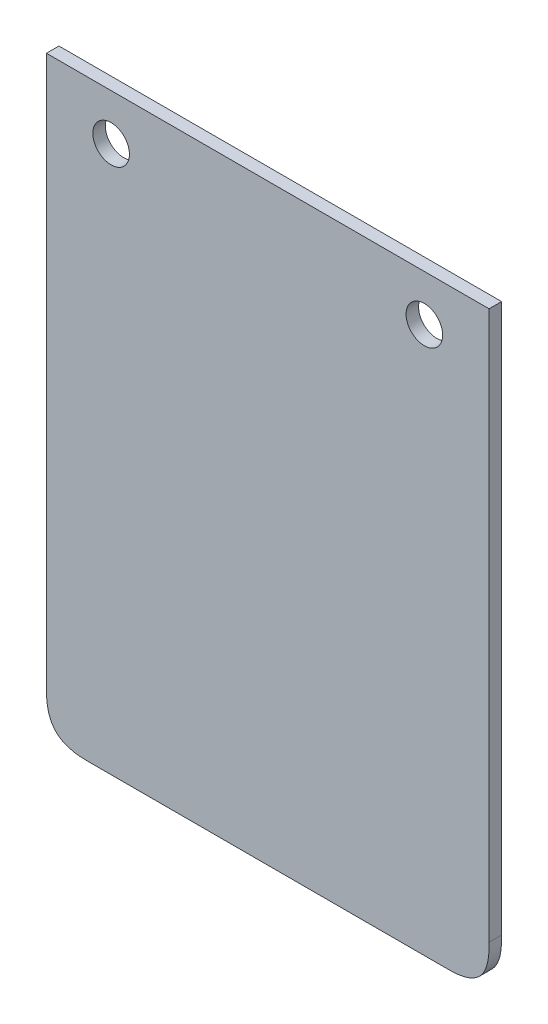
ISO-10303-21;
HEADER;
FILE_DESCRIPTION(('STEP AP214'),'2;1');
FILE_NAME('part.step','',(''),(''),'','','');
FILE_SCHEMA(('AUTOMOTIVE_DESIGN { 1 0 10303 214 1 1 1 1 }'));
ENDSEC;
DATA;
#1=APPLICATION_CONTEXT('core data for automotive mechanical design processes');
#2=APPLICATION_PROTOCOL_DEFINITION('international standard','automotive_design',2000,#1);
#3=PRODUCT_CONTEXT('',#1,'mechanical');
#4=PRODUCT('Part','Part','',(#3));
#5=PRODUCT_RELATED_PRODUCT_CATEGORY('part','',(#4));
#6=PRODUCT_DEFINITION_FORMATION('','',#4);
#7=PRODUCT_DEFINITION_CONTEXT('part definition',#1,'design');
#8=PRODUCT_DEFINITION('design','',#6,#7);
#9=PRODUCT_DEFINITION_SHAPE('','',#8);
#10=(LENGTH_UNIT() NAMED_UNIT(*) SI_UNIT(.MILLI.,.METRE.));
#11=(NAMED_UNIT(*) PLANE_ANGLE_UNIT() SI_UNIT($,.RADIAN.));
#12=(NAMED_UNIT(*) SI_UNIT($,.STERADIAN.) SOLID_ANGLE_UNIT());
#13=UNCERTAINTY_MEASURE_WITH_UNIT(LENGTH_MEASURE(1.E-05),#10,'distance_accuracy_value','');
#14=(GEOMETRIC_REPRESENTATION_CONTEXT(3) GLOBAL_UNCERTAINTY_ASSIGNED_CONTEXT((#13)) GLOBAL_UNIT_ASSIGNED_CONTEXT((#10,
#11,#12)) REPRESENTATION_CONTEXT('',''));
#15=CARTESIAN_POINT('',(0.,0.,0.));
#16=DIRECTION('',(0.,0.,1.));
#17=DIRECTION('',(1.,0.,0.));
#18=AXIS2_PLACEMENT_3D('',#15,#16,#17);
#19=CARTESIAN_POINT('',(-17.6691646267636,-20.1512394100629,1.));
#20=CARTESIAN_POINT('',(-17.6691646267636,-20.6231904776552,1.));
#21=CARTESIAN_POINT('',(-17.6527373194908,-20.8776964747589,1.));
#22=CARTESIAN_POINT('',(-17.627480029952,-21.2690041645368,1.));
#23=CARTESIAN_POINT('',(-17.554652674592,-21.5966677912601,1.));
#24=CARTESIAN_POINT('',(-17.3748195500365,-22.4057699961333,1.));
#25=CARTESIAN_POINT('',(-16.90299751508,-22.879712106307,1.));
#26=CARTESIAN_POINT('',(-16.4309295170986,-23.3539012847107,1.));
#27=CARTESIAN_POINT('',(-15.619627321153,-23.5356042355007,1.));
#28=CARTESIAN_POINT('',(-15.2926653300199,-23.6088321385952,1.));
#29=CARTESIAN_POINT('',(-14.9001363423189,-23.6345186891479,1.));
#30=CARTESIAN_POINT('',(-14.6446186681602,-23.6512394100629,1.));
#31=CARTESIAN_POINT('',(-14.1691646267636,-23.6512394100629,1.));
#32=B_SPLINE_CURVE_WITH_KNOTS('',2,(#19,#20,#21,#22,#23,#24,#25,#26,#27,#28,#29,#30,#31),
.UNSPECIFIED.,.F.,.F.,(3,2,2,2,2,2,3),(0.,0.125,0.25,0.5,0.75,0.875,1.),.UNSPECIFIED.);
#33=DIRECTION('',(0.,0.,-1.));
#34=VECTOR('',#33,1.);
#35=SURFACE_OF_LINEAR_EXTRUSION('',#32,#34);
#36=CARTESIAN_POINT('',(-17.6691646267636,-20.1512394100629,0.));
#37=CARTESIAN_POINT('',(-17.6691646267636,-20.6231904776552,0.));
#38=CARTESIAN_POINT('',(-17.6527373194908,-20.8776964747589,0.));
#39=CARTESIAN_POINT('',(-17.627480029952,-21.2690041645368,0.));
#40=CARTESIAN_POINT('',(-17.554652674592,-21.5966677912601,0.));
#41=CARTESIAN_POINT('',(-17.3748195500365,-22.4057699961333,0.));
#42=CARTESIAN_POINT('',(-16.90299751508,-22.879712106307,0.));
#43=CARTESIAN_POINT('',(-16.4309295170986,-23.3539012847107,0.));
#44=CARTESIAN_POINT('',(-15.619627321153,-23.5356042355007,0.));
#45=CARTESIAN_POINT('',(-15.2926653300199,-23.6088321385952,0.));
#46=CARTESIAN_POINT('',(-14.9001363423189,-23.6345186891479,0.));
#47=CARTESIAN_POINT('',(-14.6446186681602,-23.6512394100629,0.));
#48=CARTESIAN_POINT('',(-14.1691646267636,-23.6512394100629,0.));
#49=B_SPLINE_CURVE_WITH_KNOTS('',2,(#36,#37,#38,#39,#40,#41,#42,#43,#44,#45,#46,#47,#48),
.UNSPECIFIED.,.F.,.F.,(3,2,2,2,2,2,3),(0.,0.125,0.25,0.5,0.75,0.875,1.),.UNSPECIFIED.);
#50=CARTESIAN_POINT('',(-17.6691646267636,-20.1512394100629,0.));
#51=VERTEX_POINT('',#50);
#52=CARTESIAN_POINT('',(-14.1691646267636,-23.6512394100629,0.));
#53=VERTEX_POINT('',#52);
#54=EDGE_CURVE('E183',#51,#53,#49,.T.);
#55=ORIENTED_EDGE('',*,*,#54,.T.);
#56=DIRECTION('',(0.,0.,-1.));
#57=VECTOR('',#56,1.);
#58=CARTESIAN_POINT('',(-14.1691646267636,-23.6512394100629,1.));
#59=LINE('',#58,#57);
#60=CARTESIAN_POINT('',(-14.1691646267636,-23.6512394100629,1.));
#61=VERTEX_POINT('',#60);
#62=EDGE_CURVE('E11',#61,#53,#59,.T.);
#63=ORIENTED_EDGE('',*,*,#62,.F.);
#64=CARTESIAN_POINT('',(-14.1691646267636,-23.6512394100629,1.));
#65=CARTESIAN_POINT('',(-14.6446186681602,-23.6512394100629,1.));
#66=CARTESIAN_POINT('',(-14.9001363423189,-23.6345186891479,1.));
#67=CARTESIAN_POINT('',(-15.2926653300199,-23.6088321385952,1.));
#68=CARTESIAN_POINT('',(-15.619627321153,-23.5356042355007,1.));
#69=CARTESIAN_POINT('',(-16.4309295170986,-23.3539012847107,1.));
#70=CARTESIAN_POINT('',(-16.90299751508,-22.879712106307,1.));
#71=CARTESIAN_POINT('',(-17.3748195500365,-22.4057699961333,1.));
#72=CARTESIAN_POINT('',(-17.554652674592,-21.5966677912601,1.));
#73=CARTESIAN_POINT('',(-17.627480029952,-21.2690041645368,1.));
#74=CARTESIAN_POINT('',(-17.6527373194908,-20.8776964747589,1.));
#75=CARTESIAN_POINT('',(-17.6691646267636,-20.6231904776552,1.));
#76=CARTESIAN_POINT('',(-17.6691646267636,-20.1512394100629,1.));
#77=B_SPLINE_CURVE_WITH_KNOTS('',2,(#64,#65,#66,#67,#68,#69,#70,#71,#72,#73,#74,#75,#76),
.UNSPECIFIED.,.F.,.F.,(3,2,2,2,2,2,3),(0.,0.125,0.25,0.5,0.75,0.875,1.),.UNSPECIFIED.);
#78=CARTESIAN_POINT('',(-17.6691646267636,-20.1512394100629,1.));
#79=VERTEX_POINT('',#78);
#80=EDGE_CURVE('E164',#79,#61,#77,.F.);
#81=ORIENTED_EDGE('',*,*,#80,.F.);
#82=DIRECTION('',(0.,0.,-1.));
#83=VECTOR('',#82,1.);
#84=CARTESIAN_POINT('',(-17.6691646267636,-20.1512394100629,1.));
#85=LINE('',#84,#83);
#86=EDGE_CURVE('E118',#79,#51,#85,.T.);
#87=ORIENTED_EDGE('',*,*,#86,.T.);
#88=EDGE_LOOP('',(#55,#63,#81,#87));
#89=FACE_BOUND('',#88,.T.);
#90=ADVANCED_FACE('F33',(#89),#35,.F.);
#91=CARTESIAN_POINT('',(-14.1691646267636,-23.6512394100629,1.));
#92=DIRECTION('',(0.,1.,0.));
#93=DIRECTION('',(-1.,0.,0.));
#94=AXIS2_PLACEMENT_3D('',#91,#92,#93);
#95=PLANE('',#94);
#96=DIRECTION('',(1.,0.,0.));
#97=VECTOR('',#96,1.);
#98=CARTESIAN_POINT('',(-14.1691646267636,-23.6512394100629,0.));
#99=LINE('',#98,#97);
#100=CARTESIAN_POINT('',(14.1691646267636,-23.6512394100629,0.));
#101=VERTEX_POINT('',#100);
#102=EDGE_CURVE('E209',#53,#101,#99,.T.);
#103=ORIENTED_EDGE('',*,*,#102,.T.);
#104=DIRECTION('',(0.,0.,-1.));
#105=VECTOR('',#104,1.);
#106=CARTESIAN_POINT('',(14.1691646267636,-23.6512394100629,1.));
#107=LINE('',#106,#105);
#108=CARTESIAN_POINT('',(14.1691646267636,-23.6512394100629,1.));
#109=VERTEX_POINT('',#108);
#110=EDGE_CURVE('E44',#109,#101,#107,.T.);
#111=ORIENTED_EDGE('',*,*,#110,.F.);
#112=DIRECTION('',(1.,0.,0.));
#113=VECTOR('',#112,1.);
#114=CARTESIAN_POINT('',(-14.1691646267636,-23.6512394100629,1.));
#115=LINE('',#114,#113);
#116=EDGE_CURVE('E90',#61,#109,#115,.T.);
#117=ORIENTED_EDGE('',*,*,#116,.F.);
#118=ORIENTED_EDGE('',*,*,#62,.T.);
#119=EDGE_LOOP('',(#103,#111,#117,#118));
#120=FACE_BOUND('',#119,.T.);
#121=ADVANCED_FACE('F234',(#120),#95,.F.);
#122=CARTESIAN_POINT('',(14.1691646267636,-23.6512394100629,1.));
#123=CARTESIAN_POINT('',(14.6411156943294,-23.6512394100629,1.));
#124=CARTESIAN_POINT('',(14.8956216914596,-23.63481210279,1.));
#125=CARTESIAN_POINT('',(15.2869293811867,-23.6095548132572,1.));
#126=CARTESIAN_POINT('',(15.6145930079608,-23.5367274578913,1.));
#127=CARTESIAN_POINT('',(16.4236952128188,-23.3568943333525,1.));
#128=CARTESIAN_POINT('',(16.8976373230077,-22.8850722983793,1.));
#129=CARTESIAN_POINT('',(17.371826501409,-22.4130043003988,1.));
#130=CARTESIAN_POINT('',(17.5535294522014,-21.6017021044523,1.));
#131=CARTESIAN_POINT('',(17.6267573552938,-21.2747401133328,1.));
#132=CARTESIAN_POINT('',(17.6524439058486,-20.8822111256182,1.));
#133=CARTESIAN_POINT('',(17.6691646267636,-20.6266934514722,1.));
#134=CARTESIAN_POINT('',(17.6691646267636,-20.1512394100629,1.));
#135=B_SPLINE_CURVE_WITH_KNOTS('',2,(#122,#123,#124,#125,#126,#127,#128,#129,#130,#131,#132,
#133,#134),.UNSPECIFIED.,.F.,.F.,(3,2,2,2,2,2,3),(0.,0.125,0.25,0.5,0.75,0.875,1.),.UNSPECIFIED.);
#136=DIRECTION('',(0.,0.,-1.));
#137=VECTOR('',#136,1.);
#138=SURFACE_OF_LINEAR_EXTRUSION('',#135,#137);
#139=CARTESIAN_POINT('',(14.1691646267636,-23.6512394100629,0.));
#140=CARTESIAN_POINT('',(14.6411156943294,-23.6512394100629,0.));
#141=CARTESIAN_POINT('',(14.8956216914596,-23.63481210279,0.));
#142=CARTESIAN_POINT('',(15.2869293811867,-23.6095548132572,0.));
#143=CARTESIAN_POINT('',(15.6145930079608,-23.5367274578913,0.));
#144=CARTESIAN_POINT('',(16.4236952128188,-23.3568943333525,0.));
#145=CARTESIAN_POINT('',(16.8976373230077,-22.8850722983793,0.));
#146=CARTESIAN_POINT('',(17.371826501409,-22.4130043003988,0.));
#147=CARTESIAN_POINT('',(17.5535294522014,-21.6017021044523,0.));
#148=CARTESIAN_POINT('',(17.6267573552938,-21.2747401133328,0.));
#149=CARTESIAN_POINT('',(17.6524439058486,-20.8822111256182,0.));
#150=CARTESIAN_POINT('',(17.6691646267636,-20.6266934514722,0.));
#151=CARTESIAN_POINT('',(17.6691646267636,-20.1512394100629,0.));
#152=B_SPLINE_CURVE_WITH_KNOTS('',2,(#139,#140,#141,#142,#143,#144,#145,#146,#147,#148,#149,
#150,#151),.UNSPECIFIED.,.F.,.F.,(3,2,2,2,2,2,3),(0.,0.125,0.25,0.5,0.75,0.875,1.),.UNSPECIFIED.);
#153=CARTESIAN_POINT('',(17.6691646267636,-20.1512394100629,0.));
#154=VERTEX_POINT('',#153);
#155=EDGE_CURVE('E264',#101,#154,#152,.T.);
#156=ORIENTED_EDGE('',*,*,#155,.T.);
#157=DIRECTION('',(0.,0.,-1.));
#158=VECTOR('',#157,1.);
#159=CARTESIAN_POINT('',(17.6691646267636,-20.1512394100629,1.));
#160=LINE('',#159,#158);
#161=CARTESIAN_POINT('',(17.6691646267636,-20.1512394100629,1.));
#162=VERTEX_POINT('',#161);
#163=EDGE_CURVE('E113',#162,#154,#160,.T.);
#164=ORIENTED_EDGE('',*,*,#163,.F.);
#165=CARTESIAN_POINT('',(17.6691646267636,-20.1512394100629,1.));
#166=CARTESIAN_POINT('',(17.6691646267636,-20.6266934514722,1.));
#167=CARTESIAN_POINT('',(17.6524439058486,-20.8822111256182,1.));
#168=CARTESIAN_POINT('',(17.6267573552938,-21.2747401133328,1.));
#169=CARTESIAN_POINT('',(17.5535294522014,-21.6017021044523,1.));
#170=CARTESIAN_POINT('',(17.371826501409,-22.4130043003988,1.));
#171=CARTESIAN_POINT('',(16.8976373230077,-22.8850722983793,1.));
#172=CARTESIAN_POINT('',(16.4236952128188,-23.3568943333525,1.));
#173=CARTESIAN_POINT('',(15.6145930079608,-23.5367274578913,1.));
#174=CARTESIAN_POINT('',(15.2869293811867,-23.6095548132572,1.));
#175=CARTESIAN_POINT('',(14.8956216914596,-23.63481210279,1.));
#176=CARTESIAN_POINT('',(14.6411156943294,-23.6512394100629,1.));
#177=CARTESIAN_POINT('',(14.1691646267636,-23.6512394100629,1.));
#178=B_SPLINE_CURVE_WITH_KNOTS('',2,(#165,#166,#167,#168,#169,#170,#171,#172,#173,#174,#175,
#176,#177),.UNSPECIFIED.,.F.,.F.,(3,2,2,2,2,2,3),(0.,0.125,0.25,0.5,0.75,0.875,1.),.UNSPECIFIED.);
#179=EDGE_CURVE('E103',#109,#162,#178,.F.);
#180=ORIENTED_EDGE('',*,*,#179,.F.);
#181=ORIENTED_EDGE('',*,*,#110,.T.);
#182=EDGE_LOOP('',(#156,#164,#180,#181));
#183=FACE_BOUND('',#182,.T.);
#184=ADVANCED_FACE('F238',(#183),#138,.F.);
#185=CARTESIAN_POINT('',(17.6691646267636,-20.1512394100629,1.));
#186=DIRECTION('',(-1.,0.,0.));
#187=DIRECTION('',(0.,-1.,0.));
#188=AXIS2_PLACEMENT_3D('',#185,#186,#187);
#189=PLANE('',#188);
#190=DIRECTION('',(0.,1.,0.));
#191=VECTOR('',#190,1.);
#192=CARTESIAN_POINT('',(17.6691646267636,-20.1512394100629,0.));
#193=LINE('',#192,#191);
#194=CARTESIAN_POINT('',(17.6691646267636,23.6512394100629,0.));
#195=VERTEX_POINT('',#194);
#196=EDGE_CURVE('E112',#154,#195,#193,.T.);
#197=ORIENTED_EDGE('',*,*,#196,.T.);
#198=DIRECTION('',(0.,0.,-1.));
#199=VECTOR('',#198,1.);
#200=CARTESIAN_POINT('',(17.6691646267636,23.6512394100629,1.));
#201=LINE('',#200,#199);
#202=CARTESIAN_POINT('',(17.6691646267636,23.6512394100629,1.));
#203=VERTEX_POINT('',#202);
#204=EDGE_CURVE('E109',#203,#195,#201,.T.);
#205=ORIENTED_EDGE('',*,*,#204,.F.);
#206=DIRECTION('',(0.,1.,0.));
#207=VECTOR('',#206,1.);
#208=CARTESIAN_POINT('',(17.6691646267636,-20.1512394100629,1.));
#209=LINE('',#208,#207);
#210=EDGE_CURVE('E97',#162,#203,#209,.T.);
#211=ORIENTED_EDGE('',*,*,#210,.F.);
#212=ORIENTED_EDGE('',*,*,#163,.T.);
#213=EDGE_LOOP('',(#197,#205,#211,#212));
#214=FACE_BOUND('',#213,.T.);
#215=ADVANCED_FACE('F110',(#214),#189,.F.);
#216=CARTESIAN_POINT('',(17.6691646267636,23.6512394100629,1.));
#217=DIRECTION('',(0.,-1.,0.));
#218=DIRECTION('',(0.,0.,-1.));
#219=AXIS2_PLACEMENT_3D('',#216,#217,#218);
#220=PLANE('',#219);
#221=DIRECTION('',(-1.,0.,0.));
#222=VECTOR('',#221,1.);
#223=CARTESIAN_POINT('',(17.6691646267636,23.6512394100629,0.));
#224=LINE('',#223,#222);
#225=CARTESIAN_POINT('',(-17.6691646267636,23.6512394100629,0.));
#226=VERTEX_POINT('',#225);
#227=EDGE_CURVE('E76',#195,#226,#224,.T.);
#228=ORIENTED_EDGE('',*,*,#227,.T.);
#229=DIRECTION('',(0.,0.,-1.));
#230=VECTOR('',#229,1.);
#231=CARTESIAN_POINT('',(-17.6691646267636,23.6512394100629,1.));
#232=LINE('',#231,#230);
#233=CARTESIAN_POINT('',(-17.6691646267636,23.6512394100629,1.));
#234=VERTEX_POINT('',#233);
#235=EDGE_CURVE('E114',#234,#226,#232,.T.);
#236=ORIENTED_EDGE('',*,*,#235,.F.);
#237=DIRECTION('',(-1.,0.,0.));
#238=VECTOR('',#237,1.);
#239=CARTESIAN_POINT('',(17.6691646267636,23.6512394100629,1.));
#240=LINE('',#239,#238);
#241=EDGE_CURVE('E101',#203,#234,#240,.T.);
#242=ORIENTED_EDGE('',*,*,#241,.F.);
#243=ORIENTED_EDGE('',*,*,#204,.T.);
#244=EDGE_LOOP('',(#228,#236,#242,#243));
#245=FACE_BOUND('',#244,.T.);
#246=ADVANCED_FACE('F116',(#245),#220,.F.);
#247=CARTESIAN_POINT('',(-17.6691646267636,23.6512394100629,1.));
#248=DIRECTION('',(1.,0.,0.));
#249=DIRECTION('',(0.,0.,-1.));
#250=AXIS2_PLACEMENT_3D('',#247,#248,#249);
#251=PLANE('',#250);
#252=DIRECTION('',(0.,-1.,0.));
#253=VECTOR('',#252,1.);
#254=CARTESIAN_POINT('',(-17.6691646267636,23.6512394100629,0.));
#255=LINE('',#254,#253);
#256=EDGE_CURVE('E82',#226,#51,#255,.T.);
#257=ORIENTED_EDGE('',*,*,#256,.T.);
#258=ORIENTED_EDGE('',*,*,#86,.F.);
#259=DIRECTION('',(0.,-1.,0.));
#260=VECTOR('',#259,1.);
#261=CARTESIAN_POINT('',(-17.6691646267636,23.6512394100629,1.));
#262=LINE('',#261,#260);
#263=EDGE_CURVE('E53',#234,#79,#262,.T.);
#264=ORIENTED_EDGE('',*,*,#263,.F.);
#265=ORIENTED_EDGE('',*,*,#235,.T.);
#266=EDGE_LOOP('',(#257,#258,#264,#265));
#267=FACE_BOUND('',#266,.T.);
#268=ADVANCED_FACE('F142',(#267),#251,.F.);
#269=CARTESIAN_POINT('',(-16.90299751508,-22.879712106307,1.));
#270=DIRECTION('',(0.,0.,-1.));
#271=DIRECTION('',(-1.,0.,0.));
#272=AXIS2_PLACEMENT_3D('',#269,#270,#271);
#273=PLANE('',#272);
#274=CARTESIAN_POINT('',(12.503417236206,19.975,1.));
#275=DIRECTION('',(0.,0.,1.));
#276=DIRECTION('',(1.,0.,0.));
#277=AXIS2_PLACEMENT_3D('',#274,#275,#276);
#278=CIRCLE('',#277,1.4613097260437);
#279=CARTESIAN_POINT('',(13.9647269622497,19.975,1.));
#280=VERTEX_POINT('',#279);
#281=EDGE_CURVE('E215',#280,#280,#278,.T.);
#282=ORIENTED_EDGE('',*,*,#281,.F.);
#283=EDGE_LOOP('',(#282));
#284=FACE_BOUND('',#283,.T.);
#285=CARTESIAN_POINT('',(-12.503417236206,19.975,1.));
#286=DIRECTION('',(0.,0.,1.));
#287=DIRECTION('',(1.,0.,0.));
#288=AXIS2_PLACEMENT_3D('',#285,#286,#287);
#289=CIRCLE('',#288,1.4613097260437);
#290=CARTESIAN_POINT('',(-11.0421075101623,19.975,1.));
#291=VERTEX_POINT('',#290);
#292=EDGE_CURVE('E206',#291,#291,#289,.T.);
#293=ORIENTED_EDGE('',*,*,#292,.F.);
#294=EDGE_LOOP('',(#293));
#295=FACE_BOUND('',#294,.T.);
#296=ORIENTED_EDGE('',*,*,#80,.T.);
#297=ORIENTED_EDGE('',*,*,#116,.T.);
#298=ORIENTED_EDGE('',*,*,#179,.T.);
#299=ORIENTED_EDGE('',*,*,#210,.T.);
#300=ORIENTED_EDGE('',*,*,#241,.T.);
#301=ORIENTED_EDGE('',*,*,#263,.T.);
#302=EDGE_LOOP('',(#296,#297,#298,#299,#300,#301));
#303=FACE_BOUND('',#302,.T.);
#304=ADVANCED_FACE('F99',(#284,#295,#303),#273,.F.);
#305=CARTESIAN_POINT('',(-16.90299751508,-22.879712106307,0.));
#306=DIRECTION('',(0.,0.,-1.));
#307=DIRECTION('',(-1.,0.,0.));
#308=AXIS2_PLACEMENT_3D('',#305,#306,#307);
#309=PLANE('',#308);
#310=CARTESIAN_POINT('',(12.503417236206,19.975,0.));
#311=DIRECTION('',(0.,0.,-1.));
#312=DIRECTION('',(-1.,0.,0.));
#313=AXIS2_PLACEMENT_3D('',#310,#311,#312);
#314=CIRCLE('',#313,1.4613097260437);
#315=CARTESIAN_POINT('',(11.0421075101623,19.975,0.));
#316=VERTEX_POINT('',#315);
#317=EDGE_CURVE('E38',#316,#316,#314,.T.);
#318=ORIENTED_EDGE('',*,*,#317,.F.);
#319=EDGE_LOOP('',(#318));
#320=FACE_BOUND('',#319,.T.);
#321=CARTESIAN_POINT('',(-12.503417236206,19.975,0.));
#322=DIRECTION('',(0.,0.,-1.));
#323=DIRECTION('',(-1.,0.,0.));
#324=AXIS2_PLACEMENT_3D('',#321,#322,#323);
#325=CIRCLE('',#324,1.4613097260437);
#326=CARTESIAN_POINT('',(-13.9647269622497,19.975,0.));
#327=VERTEX_POINT('',#326);
#328=EDGE_CURVE('E204',#327,#327,#325,.T.);
#329=ORIENTED_EDGE('',*,*,#328,.F.);
#330=EDGE_LOOP('',(#329));
#331=FACE_BOUND('',#330,.T.);
#332=ORIENTED_EDGE('',*,*,#54,.F.);
#333=ORIENTED_EDGE('',*,*,#256,.F.);
#334=ORIENTED_EDGE('',*,*,#227,.F.);
#335=ORIENTED_EDGE('',*,*,#196,.F.);
#336=ORIENTED_EDGE('',*,*,#155,.F.);
#337=ORIENTED_EDGE('',*,*,#102,.F.);
#338=EDGE_LOOP('',(#332,#333,#334,#335,#336,#337));
#339=FACE_BOUND('',#338,.T.);
#340=ADVANCED_FACE('F141',(#320,#331,#339),#309,.T.);
#341=CARTESIAN_POINT('',(-12.503417236206,19.975,-0.0499999999999999));
#342=DIRECTION('',(0.,0.,1.));
#343=DIRECTION('',(1.,0.,0.));
#344=AXIS2_PLACEMENT_3D('',#341,#342,#343);
#345=CYLINDRICAL_SURFACE('',#344,1.4613097260437);
#346=ORIENTED_EDGE('',*,*,#328,.T.);
#347=EDGE_LOOP('',(#346));
#348=FACE_BOUND('',#347,.T.);
#349=ORIENTED_EDGE('',*,*,#292,.T.);
#350=EDGE_LOOP('',(#349));
#351=FACE_BOUND('',#350,.T.);
#352=ADVANCED_FACE('F144',(#348,#351),#345,.F.);
#353=CARTESIAN_POINT('',(12.503417236206,19.975,-0.0499999999999999));
#354=DIRECTION('',(0.,0.,1.));
#355=DIRECTION('',(1.,0.,0.));
#356=AXIS2_PLACEMENT_3D('',#353,#354,#355);
#357=CYLINDRICAL_SURFACE('',#356,1.4613097260437);
#358=ORIENTED_EDGE('',*,*,#317,.T.);
#359=EDGE_LOOP('',(#358));
#360=FACE_BOUND('',#359,.T.);
#361=ORIENTED_EDGE('',*,*,#281,.T.);
#362=EDGE_LOOP('',(#361));
#363=FACE_BOUND('',#362,.T.);
#364=ADVANCED_FACE('F226',(#360,#363),#357,.F.);
#365=CLOSED_SHELL('',(#90,#121,#184,#215,#246,#268,#304,#340,#352,#364));
#366=MANIFOLD_SOLID_BREP('B2',#365);
#367=ADVANCED_BREP_SHAPE_REPRESENTATION('',(#18,#366),#14);
#368=SHAPE_DEFINITION_REPRESENTATION(#9,#367);
ENDSEC;
END-ISO-10303-21;
